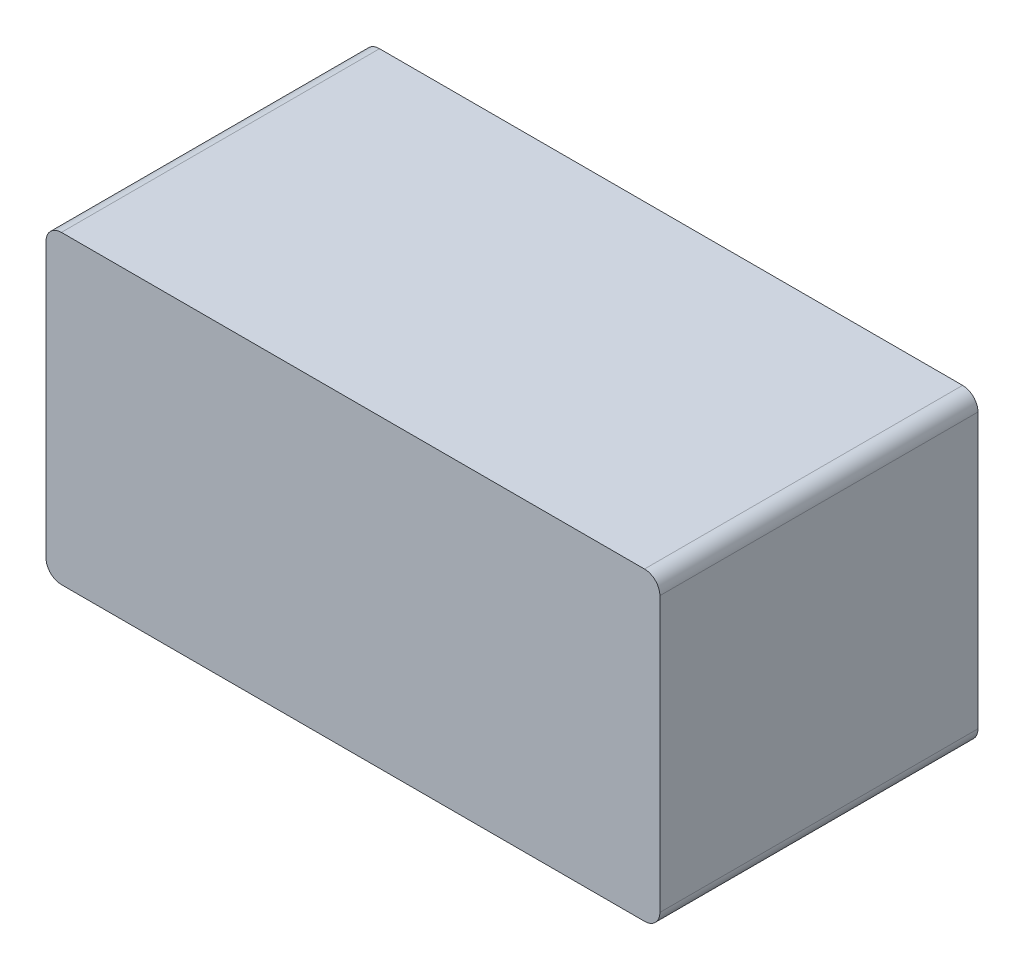
ISO-10303-21;
HEADER;
FILE_DESCRIPTION(('STEP AP214'),'2;1');
FILE_NAME('part.step','',(''),(''),'','','');
FILE_SCHEMA(('AUTOMOTIVE_DESIGN { 1 0 10303 214 1 1 1 1 }'));
ENDSEC;
DATA;
#1=APPLICATION_CONTEXT('core data for automotive mechanical design processes');
#2=APPLICATION_PROTOCOL_DEFINITION('international standard','automotive_design',2000,#1);
#3=PRODUCT_CONTEXT('',#1,'mechanical');
#4=PRODUCT('Part','Part','',(#3));
#5=PRODUCT_RELATED_PRODUCT_CATEGORY('part','',(#4));
#6=PRODUCT_DEFINITION_FORMATION('','',#4);
#7=PRODUCT_DEFINITION_CONTEXT('part definition',#1,'design');
#8=PRODUCT_DEFINITION('design','',#6,#7);
#9=PRODUCT_DEFINITION_SHAPE('','',#8);
#10=(LENGTH_UNIT() NAMED_UNIT(*) SI_UNIT(.MILLI.,.METRE.));
#11=(NAMED_UNIT(*) PLANE_ANGLE_UNIT() SI_UNIT($,.RADIAN.));
#12=(NAMED_UNIT(*) SI_UNIT($,.STERADIAN.) SOLID_ANGLE_UNIT());
#13=UNCERTAINTY_MEASURE_WITH_UNIT(LENGTH_MEASURE(1.E-05),#10,'distance_accuracy_value','');
#14=(GEOMETRIC_REPRESENTATION_CONTEXT(3) GLOBAL_UNCERTAINTY_ASSIGNED_CONTEXT((#13)) GLOBAL_UNIT_ASSIGNED_CONTEXT((#10,
#11,#12)) REPRESENTATION_CONTEXT('',''));
#15=CARTESIAN_POINT('',(0.,0.,0.));
#16=DIRECTION('',(0.,0.,1.));
#17=DIRECTION('',(1.,0.,0.));
#18=AXIS2_PLACEMENT_3D('',#15,#16,#17);
#19=CARTESIAN_POINT('',(18.94,8.91,0.));
#20=DIRECTION('',(0.,0.,1.));
#21=DIRECTION('',(1.,0.,0.));
#22=AXIS2_PLACEMENT_3D('',#19,#20,#21);
#23=CYLINDRICAL_SURFACE('',#22,1.);
#24=CARTESIAN_POINT('',(18.94,8.91,0.));
#25=DIRECTION('',(0.,0.,1.));
#26=DIRECTION('',(1.,0.,0.));
#27=AXIS2_PLACEMENT_3D('',#24,#25,#26);
#28=CIRCLE('',#27,1.);
#29=CARTESIAN_POINT('',(19.94,8.91,0.));
#30=VERTEX_POINT('',#29);
#31=CARTESIAN_POINT('',(18.94,9.91000000000001,0.));
#32=VERTEX_POINT('',#31);
#33=EDGE_CURVE('E121',#30,#32,#28,.T.);
#34=ORIENTED_EDGE('',*,*,#33,.T.);
#35=DIRECTION('',(0.,0.,1.));
#36=VECTOR('',#35,1.);
#37=CARTESIAN_POINT('',(18.94,9.91000000000001,0.));
#38=LINE('',#37,#36);
#39=CARTESIAN_POINT('',(18.94,9.91000000000001,20.6666));
#40=VERTEX_POINT('',#39);
#41=EDGE_CURVE('E116',#40,#32,#38,.F.);
#42=ORIENTED_EDGE('',*,*,#41,.F.);
#43=CARTESIAN_POINT('',(18.94,8.91,20.6666));
#44=DIRECTION('',(0.,0.,1.));
#45=DIRECTION('',(1.,0.,0.));
#46=AXIS2_PLACEMENT_3D('',#43,#44,#45);
#47=CIRCLE('',#46,1.);
#48=CARTESIAN_POINT('',(19.94,8.91,20.6666));
#49=VERTEX_POINT('',#48);
#50=EDGE_CURVE('E19',#40,#49,#47,.F.);
#51=ORIENTED_EDGE('',*,*,#50,.T.);
#52=DIRECTION('',(0.,0.,-1.));
#53=VECTOR('',#52,1.);
#54=CARTESIAN_POINT('',(19.94,8.91,0.));
#55=LINE('',#54,#53);
#56=EDGE_CURVE('E119',#30,#49,#55,.F.);
#57=ORIENTED_EDGE('',*,*,#56,.F.);
#58=EDGE_LOOP('',(#34,#42,#51,#57));
#59=FACE_BOUND('',#58,.T.);
#60=ADVANCED_FACE('F16',(#59),#23,.T.);
#61=CARTESIAN_POINT('',(19.94,9.91000000000001,0.));
#62=DIRECTION('',(1.,0.,0.));
#63=DIRECTION('',(0.,0.,-1.));
#64=AXIS2_PLACEMENT_3D('',#61,#62,#63);
#65=PLANE('',#64);
#66=DIRECTION('',(0.,0.,1.));
#67=VECTOR('',#66,1.);
#68=CARTESIAN_POINT('',(19.94,-8.91,0.));
#69=LINE('',#68,#67);
#70=CARTESIAN_POINT('',(19.94,-8.91,0.));
#71=VERTEX_POINT('',#70);
#72=CARTESIAN_POINT('',(19.94,-8.91,20.6666));
#73=VERTEX_POINT('',#72);
#74=EDGE_CURVE('E68',#71,#73,#69,.T.);
#75=ORIENTED_EDGE('',*,*,#74,.F.);
#76=DIRECTION('',(0.,1.,0.));
#77=VECTOR('',#76,1.);
#78=CARTESIAN_POINT('',(19.94,0.,0.));
#79=LINE('',#78,#77);
#80=EDGE_CURVE('E131',#30,#71,#79,.F.);
#81=ORIENTED_EDGE('',*,*,#80,.F.);
#82=ORIENTED_EDGE('',*,*,#56,.T.);
#83=DIRECTION('',(0.,1.,0.));
#84=VECTOR('',#83,1.);
#85=CARTESIAN_POINT('',(19.94,0.,20.6666));
#86=LINE('',#85,#84);
#87=EDGE_CURVE('E128',#73,#49,#86,.T.);
#88=ORIENTED_EDGE('',*,*,#87,.F.);
#89=EDGE_LOOP('',(#75,#81,#82,#88));
#90=FACE_BOUND('',#89,.T.);
#91=ADVANCED_FACE('F158',(#90),#65,.T.);
#92=CARTESIAN_POINT('',(-19.94,9.91000000000001,0.));
#93=DIRECTION('',(0.,1.,0.));
#94=DIRECTION('',(0.,0.,1.));
#95=AXIS2_PLACEMENT_3D('',#92,#93,#94);
#96=PLANE('',#95);
#97=ORIENTED_EDGE('',*,*,#41,.T.);
#98=DIRECTION('',(-1.,0.,0.));
#99=VECTOR('',#98,1.);
#100=CARTESIAN_POINT('',(0.,9.91000000000001,0.));
#101=LINE('',#100,#99);
#102=CARTESIAN_POINT('',(-18.94,9.91000000000001,0.));
#103=VERTEX_POINT('',#102);
#104=EDGE_CURVE('E133',#103,#32,#101,.F.);
#105=ORIENTED_EDGE('',*,*,#104,.F.);
#106=DIRECTION('',(0.,0.,1.));
#107=VECTOR('',#106,1.);
#108=CARTESIAN_POINT('',(-18.94,9.91,0.));
#109=LINE('',#108,#107);
#110=CARTESIAN_POINT('',(-18.94,9.91000000000001,20.6666));
#111=VERTEX_POINT('',#110);
#112=EDGE_CURVE('E114',#111,#103,#109,.F.);
#113=ORIENTED_EDGE('',*,*,#112,.F.);
#114=DIRECTION('',(1.,0.,0.));
#115=VECTOR('',#114,1.);
#116=CARTESIAN_POINT('',(0.,9.91000000000001,20.6666));
#117=LINE('',#116,#115);
#118=EDGE_CURVE('E100',#40,#111,#117,.F.);
#119=ORIENTED_EDGE('',*,*,#118,.F.);
#120=EDGE_LOOP('',(#97,#105,#113,#119));
#121=FACE_BOUND('',#120,.T.);
#122=ADVANCED_FACE('F139',(#121),#96,.T.);
#123=CARTESIAN_POINT('',(-18.94,8.91,0.));
#124=DIRECTION('',(0.,0.,1.));
#125=DIRECTION('',(1.,0.,0.));
#126=AXIS2_PLACEMENT_3D('',#123,#124,#125);
#127=CYLINDRICAL_SURFACE('',#126,1.);
#128=CARTESIAN_POINT('',(-18.94,8.91,0.));
#129=DIRECTION('',(0.,0.,1.));
#130=DIRECTION('',(1.,0.,0.));
#131=AXIS2_PLACEMENT_3D('',#128,#129,#130);
#132=CIRCLE('',#131,1.);
#133=CARTESIAN_POINT('',(-19.94,8.91,0.));
#134=VERTEX_POINT('',#133);
#135=EDGE_CURVE('E89',#134,#103,#132,.F.);
#136=ORIENTED_EDGE('',*,*,#135,.F.);
#137=DIRECTION('',(0.,0.,1.));
#138=VECTOR('',#137,1.);
#139=CARTESIAN_POINT('',(-19.94,8.91,0.));
#140=LINE('',#139,#138);
#141=CARTESIAN_POINT('',(-19.94,8.91,20.6666));
#142=VERTEX_POINT('',#141);
#143=EDGE_CURVE('E103',#142,#134,#140,.F.);
#144=ORIENTED_EDGE('',*,*,#143,.F.);
#145=CARTESIAN_POINT('',(-18.94,8.91,20.6666));
#146=DIRECTION('',(0.,0.,1.));
#147=DIRECTION('',(1.,0.,0.));
#148=AXIS2_PLACEMENT_3D('',#145,#146,#147);
#149=CIRCLE('',#148,1.);
#150=EDGE_CURVE('E94',#111,#142,#149,.T.);
#151=ORIENTED_EDGE('',*,*,#150,.F.);
#152=ORIENTED_EDGE('',*,*,#112,.T.);
#153=EDGE_LOOP('',(#136,#144,#151,#152));
#154=FACE_BOUND('',#153,.T.);
#155=ADVANCED_FACE('F104',(#154),#127,.T.);
#156=CARTESIAN_POINT('',(0.,0.,0.));
#157=DIRECTION('',(0.,0.,-1.));
#158=DIRECTION('',(-1.,0.,0.));
#159=AXIS2_PLACEMENT_3D('',#156,#157,#158);
#160=PLANE('',#159);
#161=CARTESIAN_POINT('',(18.94,-8.91,0.));
#162=DIRECTION('',(0.,0.,1.));
#163=DIRECTION('',(1.,0.,0.));
#164=AXIS2_PLACEMENT_3D('',#161,#162,#163);
#165=CIRCLE('',#164,1.);
#166=CARTESIAN_POINT('',(18.94,-9.91000000000001,0.));
#167=VERTEX_POINT('',#166);
#168=EDGE_CURVE('E123',#167,#71,#165,.T.);
#169=ORIENTED_EDGE('',*,*,#168,.F.);
#170=DIRECTION('',(1.,0.,0.));
#171=VECTOR('',#170,1.);
#172=CARTESIAN_POINT('',(19.94,-9.91000000000001,0.));
#173=LINE('',#172,#171);
#174=CARTESIAN_POINT('',(-18.94,-9.91000000000001,0.));
#175=VERTEX_POINT('',#174);
#176=EDGE_CURVE('E144',#175,#167,#173,.T.);
#177=ORIENTED_EDGE('',*,*,#176,.F.);
#178=CARTESIAN_POINT('',(-18.94,-8.91,0.));
#179=DIRECTION('',(0.,0.,1.));
#180=DIRECTION('',(1.,0.,0.));
#181=AXIS2_PLACEMENT_3D('',#178,#179,#180);
#182=CIRCLE('',#181,1.);
#183=CARTESIAN_POINT('',(-19.94,-8.91,0.));
#184=VERTEX_POINT('',#183);
#185=EDGE_CURVE('E33',#175,#184,#182,.F.);
#186=ORIENTED_EDGE('',*,*,#185,.T.);
#187=DIRECTION('',(0.,1.,0.));
#188=VECTOR('',#187,1.);
#189=CARTESIAN_POINT('',(-19.94,-9.91000000000001,0.));
#190=LINE('',#189,#188);
#191=EDGE_CURVE('E107',#134,#184,#190,.F.);
#192=ORIENTED_EDGE('',*,*,#191,.F.);
#193=ORIENTED_EDGE('',*,*,#135,.T.);
#194=ORIENTED_EDGE('',*,*,#104,.T.);
#195=ORIENTED_EDGE('',*,*,#33,.F.);
#196=ORIENTED_EDGE('',*,*,#80,.T.);
#197=EDGE_LOOP('',(#169,#177,#186,#192,#193,#194,#195,#196));
#198=FACE_BOUND('',#197,.T.);
#199=ADVANCED_FACE('F140',(#198),#160,.T.);
#200=CARTESIAN_POINT('',(18.94,-8.91,0.));
#201=DIRECTION('',(0.,0.,1.));
#202=DIRECTION('',(1.,0.,0.));
#203=AXIS2_PLACEMENT_3D('',#200,#201,#202);
#204=CYLINDRICAL_SURFACE('',#203,1.);
#205=ORIENTED_EDGE('',*,*,#168,.T.);
#206=ORIENTED_EDGE('',*,*,#74,.T.);
#207=CARTESIAN_POINT('',(18.94,-8.91,20.6666));
#208=DIRECTION('',(0.,0.,1.));
#209=DIRECTION('',(1.,0.,0.));
#210=AXIS2_PLACEMENT_3D('',#207,#208,#209);
#211=CIRCLE('',#210,1.);
#212=CARTESIAN_POINT('',(18.94,-9.91000000000001,20.6666));
#213=VERTEX_POINT('',#212);
#214=EDGE_CURVE('E125',#213,#73,#211,.T.);
#215=ORIENTED_EDGE('',*,*,#214,.F.);
#216=DIRECTION('',(0.,0.,-1.));
#217=VECTOR('',#216,1.);
#218=CARTESIAN_POINT('',(18.94,-9.91000000000001,0.));
#219=LINE('',#218,#217);
#220=EDGE_CURVE('E146',#167,#213,#219,.F.);
#221=ORIENTED_EDGE('',*,*,#220,.F.);
#222=EDGE_LOOP('',(#205,#206,#215,#221));
#223=FACE_BOUND('',#222,.T.);
#224=ADVANCED_FACE('F160',(#223),#204,.T.);
#225=CARTESIAN_POINT('',(0.,0.,20.6666));
#226=DIRECTION('',(0.,0.,1.));
#227=DIRECTION('',(1.,0.,0.));
#228=AXIS2_PLACEMENT_3D('',#225,#226,#227);
#229=PLANE('',#228);
#230=ORIENTED_EDGE('',*,*,#150,.T.);
#231=DIRECTION('',(0.,1.,0.));
#232=VECTOR('',#231,1.);
#233=CARTESIAN_POINT('',(-19.94,-9.91000000000001,20.6666));
#234=LINE('',#233,#232);
#235=CARTESIAN_POINT('',(-19.94,-8.91,20.6666));
#236=VERTEX_POINT('',#235);
#237=EDGE_CURVE('E97',#236,#142,#234,.T.);
#238=ORIENTED_EDGE('',*,*,#237,.F.);
#239=CARTESIAN_POINT('',(-18.94,-8.91,20.6666));
#240=DIRECTION('',(0.,0.,1.));
#241=DIRECTION('',(1.,0.,0.));
#242=AXIS2_PLACEMENT_3D('',#239,#240,#241);
#243=CIRCLE('',#242,1.);
#244=CARTESIAN_POINT('',(-18.94,-9.91000000000001,20.6666));
#245=VERTEX_POINT('',#244);
#246=EDGE_CURVE('E122',#236,#245,#243,.T.);
#247=ORIENTED_EDGE('',*,*,#246,.T.);
#248=DIRECTION('',(1.,0.,0.));
#249=VECTOR('',#248,1.);
#250=CARTESIAN_POINT('',(19.94,-9.91000000000001,20.6666));
#251=LINE('',#250,#249);
#252=EDGE_CURVE('E150',#213,#245,#251,.F.);
#253=ORIENTED_EDGE('',*,*,#252,.F.);
#254=ORIENTED_EDGE('',*,*,#214,.T.);
#255=ORIENTED_EDGE('',*,*,#87,.T.);
#256=ORIENTED_EDGE('',*,*,#50,.F.);
#257=ORIENTED_EDGE('',*,*,#118,.T.);
#258=EDGE_LOOP('',(#230,#238,#247,#253,#254,#255,#256,#257));
#259=FACE_BOUND('',#258,.T.);
#260=ADVANCED_FACE('F95',(#259),#229,.T.);
#261=CARTESIAN_POINT('',(-19.94,-9.91000000000001,0.));
#262=DIRECTION('',(-1.,0.,0.));
#263=DIRECTION('',(0.,0.,1.));
#264=AXIS2_PLACEMENT_3D('',#261,#262,#263);
#265=PLANE('',#264);
#266=ORIENTED_EDGE('',*,*,#143,.T.);
#267=ORIENTED_EDGE('',*,*,#191,.T.);
#268=DIRECTION('',(0.,0.,1.));
#269=VECTOR('',#268,1.);
#270=CARTESIAN_POINT('',(-19.94,-8.91,0.));
#271=LINE('',#270,#269);
#272=EDGE_CURVE('E25',#236,#184,#271,.F.);
#273=ORIENTED_EDGE('',*,*,#272,.F.);
#274=ORIENTED_EDGE('',*,*,#237,.T.);
#275=EDGE_LOOP('',(#266,#267,#273,#274));
#276=FACE_BOUND('',#275,.T.);
#277=ADVANCED_FACE('F109',(#276),#265,.T.);
#278=CARTESIAN_POINT('',(19.94,-9.91000000000001,0.));
#279=DIRECTION('',(0.,-1.,0.));
#280=DIRECTION('',(0.,0.,-1.));
#281=AXIS2_PLACEMENT_3D('',#278,#279,#280);
#282=PLANE('',#281);
#283=ORIENTED_EDGE('',*,*,#220,.T.);
#284=ORIENTED_EDGE('',*,*,#252,.T.);
#285=DIRECTION('',(0.,0.,1.));
#286=VECTOR('',#285,1.);
#287=CARTESIAN_POINT('',(-18.94,-9.91,0.));
#288=LINE('',#287,#286);
#289=EDGE_CURVE('E10',#175,#245,#288,.T.);
#290=ORIENTED_EDGE('',*,*,#289,.F.);
#291=ORIENTED_EDGE('',*,*,#176,.T.);
#292=EDGE_LOOP('',(#283,#284,#290,#291));
#293=FACE_BOUND('',#292,.T.);
#294=ADVANCED_FACE('F161',(#293),#282,.T.);
#295=CARTESIAN_POINT('',(-18.94,-8.91,0.));
#296=DIRECTION('',(0.,0.,1.));
#297=DIRECTION('',(1.,0.,0.));
#298=AXIS2_PLACEMENT_3D('',#295,#296,#297);
#299=CYLINDRICAL_SURFACE('',#298,1.);
#300=ORIENTED_EDGE('',*,*,#185,.F.);
#301=ORIENTED_EDGE('',*,*,#289,.T.);
#302=ORIENTED_EDGE('',*,*,#246,.F.);
#303=ORIENTED_EDGE('',*,*,#272,.T.);
#304=EDGE_LOOP('',(#300,#301,#302,#303));
#305=FACE_BOUND('',#304,.T.);
#306=ADVANCED_FACE('F162',(#305),#299,.T.);
#307=CLOSED_SHELL('',(#60,#91,#122,#155,#199,#224,#260,#277,#294,#306));
#308=MANIFOLD_SOLID_BREP('B1',#307);
#309=ADVANCED_BREP_SHAPE_REPRESENTATION('',(#18,#308),#14);
#310=SHAPE_DEFINITION_REPRESENTATION(#9,#309);
ENDSEC;
END-ISO-10303-21;
